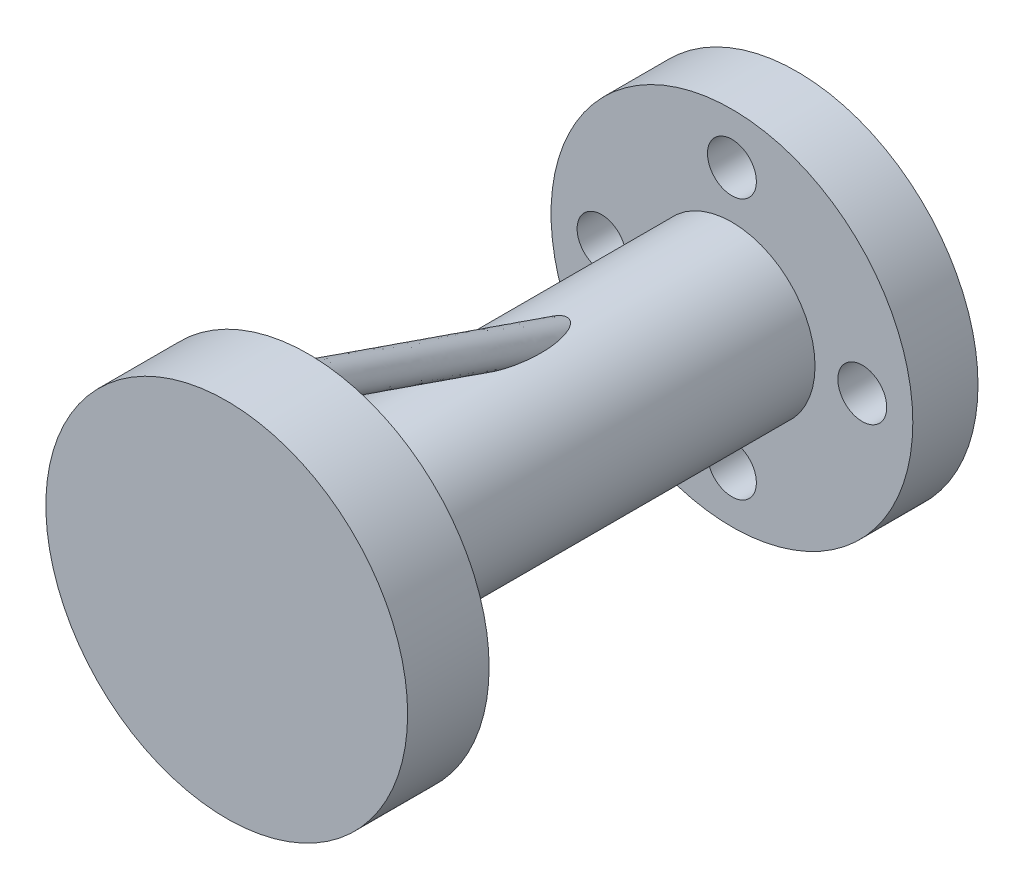
ISO-10303-21;
HEADER;
FILE_DESCRIPTION(('STEP AP214'),'2;1');
FILE_NAME('part.step','',(''),(''),'','','');
FILE_SCHEMA(('AUTOMOTIVE_DESIGN { 1 0 10303 214 1 1 1 1 }'));
ENDSEC;
DATA;
#1=APPLICATION_CONTEXT('core data for automotive mechanical design processes');
#2=APPLICATION_PROTOCOL_DEFINITION('international standard','automotive_design',2000,#1);
#3=PRODUCT_CONTEXT('',#1,'mechanical');
#4=PRODUCT('Part','Part','',(#3));
#5=PRODUCT_RELATED_PRODUCT_CATEGORY('part','',(#4));
#6=PRODUCT_DEFINITION_FORMATION('','',#4);
#7=PRODUCT_DEFINITION_CONTEXT('part definition',#1,'design');
#8=PRODUCT_DEFINITION('design','',#6,#7);
#9=PRODUCT_DEFINITION_SHAPE('','',#8);
#10=(LENGTH_UNIT() NAMED_UNIT(*) SI_UNIT(.MILLI.,.METRE.));
#11=(NAMED_UNIT(*) PLANE_ANGLE_UNIT() SI_UNIT($,.RADIAN.));
#12=(NAMED_UNIT(*) SI_UNIT($,.STERADIAN.) SOLID_ANGLE_UNIT());
#13=UNCERTAINTY_MEASURE_WITH_UNIT(LENGTH_MEASURE(1.E-05),#10,'distance_accuracy_value','');
#14=(GEOMETRIC_REPRESENTATION_CONTEXT(3) GLOBAL_UNCERTAINTY_ASSIGNED_CONTEXT((#13)) GLOBAL_UNIT_ASSIGNED_CONTEXT((#10,
#11,#12)) REPRESENTATION_CONTEXT('',''));
#15=CARTESIAN_POINT('',(0.,0.,0.));
#16=DIRECTION('',(0.,0.,1.));
#17=DIRECTION('',(1.,0.,0.));
#18=AXIS2_PLACEMENT_3D('',#15,#16,#17);
#19=CARTESIAN_POINT('',(0.,0.,4.));
#20=DIRECTION('',(0.,0.,1.));
#21=DIRECTION('',(1.,0.,0.));
#22=AXIS2_PLACEMENT_3D('',#19,#20,#21);
#23=PLANE('',#22);
#24=CARTESIAN_POINT('',(4.51808198568511E-13,-8.,4.));
#25=DIRECTION('',(0.,0.,1.));
#26=DIRECTION('',(1.,0.,0.));
#27=AXIS2_PLACEMENT_3D('',#24,#25,#26);
#28=CIRCLE('',#27,1.50000000000049);
#29=CARTESIAN_POINT('',(1.50000000000094,-8.,4.));
#30=VERTEX_POINT('',#29);
#31=EDGE_CURVE('E131',#30,#30,#28,.T.);
#32=ORIENTED_EDGE('',*,*,#31,.F.);
#33=EDGE_LOOP('',(#32));
#34=FACE_BOUND('',#33,.T.);
#35=CARTESIAN_POINT('',(0.,8.,4.));
#36=DIRECTION('',(0.,0.,1.));
#37=DIRECTION('',(1.,0.,0.));
#38=AXIS2_PLACEMENT_3D('',#35,#36,#37);
#39=CIRCLE('',#38,1.5);
#40=CARTESIAN_POINT('',(1.5,8.,4.));
#41=VERTEX_POINT('',#40);
#42=EDGE_CURVE('E143',#41,#41,#39,.T.);
#43=ORIENTED_EDGE('',*,*,#42,.F.);
#44=EDGE_LOOP('',(#43));
#45=FACE_BOUND('',#44,.T.);
#46=CARTESIAN_POINT('',(0.,0.,4.));
#47=DIRECTION('',(0.,0.,1.));
#48=DIRECTION('',(1.,0.,0.));
#49=AXIS2_PLACEMENT_3D('',#46,#47,#48);
#50=CIRCLE('',#49,11.1);
#51=CARTESIAN_POINT('',(11.1,0.,4.));
#52=VERTEX_POINT('',#51);
#53=EDGE_CURVE('E43',#52,#52,#50,.T.);
#54=ORIENTED_EDGE('',*,*,#53,.T.);
#55=EDGE_LOOP('',(#54));
#56=FACE_BOUND('',#55,.T.);
#57=CARTESIAN_POINT('',(0.,0.,4.));
#58=DIRECTION('',(0.,0.,1.));
#59=DIRECTION('',(1.,0.,0.));
#60=AXIS2_PLACEMENT_3D('',#57,#58,#59);
#61=CIRCLE('',#60,5.1);
#62=CARTESIAN_POINT('',(5.1,0.,4.));
#63=VERTEX_POINT('',#62);
#64=EDGE_CURVE('E146',#63,#63,#61,.T.);
#65=ORIENTED_EDGE('',*,*,#64,.F.);
#66=EDGE_LOOP('',(#65));
#67=FACE_BOUND('',#66,.T.);
#68=CARTESIAN_POINT('',(8.00000000000023,2.25904099284255E-13,4.));
#69=DIRECTION('',(0.,0.,1.));
#70=DIRECTION('',(1.,0.,0.));
#71=AXIS2_PLACEMENT_3D('',#68,#69,#70);
#72=CIRCLE('',#71,1.50000000000018);
#73=CARTESIAN_POINT('',(9.5000000000004,2.25904099284255E-13,4.));
#74=VERTEX_POINT('',#73);
#75=EDGE_CURVE('E137',#74,#74,#72,.T.);
#76=ORIENTED_EDGE('',*,*,#75,.F.);
#77=EDGE_LOOP('',(#76));
#78=FACE_BOUND('',#77,.T.);
#79=CARTESIAN_POINT('',(-7.99999999999977,-2.26883816723573E-13,4.));
#80=DIRECTION('',(0.,0.,1.));
#81=DIRECTION('',(1.,0.,0.));
#82=AXIS2_PLACEMENT_3D('',#79,#80,#81);
#83=CIRCLE('',#82,1.50000000000036);
#84=CARTESIAN_POINT('',(-6.49999999999941,-2.26883816723573E-13,4.));
#85=VERTEX_POINT('',#84);
#86=EDGE_CURVE('E119',#85,#85,#83,.T.);
#87=ORIENTED_EDGE('',*,*,#86,.F.);
#88=EDGE_LOOP('',(#87));
#89=FACE_BOUND('',#88,.T.);
#90=ADVANCED_FACE('F35',(#34,#45,#56,#67,#78,#89),#23,.T.);
#91=CARTESIAN_POINT('',(0.,0.,0.));
#92=DIRECTION('',(0.,0.,1.));
#93=DIRECTION('',(1.,0.,0.));
#94=AXIS2_PLACEMENT_3D('',#91,#92,#93);
#95=PLANE('',#94);
#96=CARTESIAN_POINT('',(0.,0.,0.));
#97=DIRECTION('',(0.,0.,1.));
#98=DIRECTION('',(1.,0.,0.));
#99=AXIS2_PLACEMENT_3D('',#96,#97,#98);
#100=CIRCLE('',#99,11.1);
#101=CARTESIAN_POINT('',(11.1,0.,0.));
#102=VERTEX_POINT('',#101);
#103=EDGE_CURVE('E39',#102,#102,#100,.T.);
#104=ORIENTED_EDGE('',*,*,#103,.F.);
#105=EDGE_LOOP('',(#104));
#106=FACE_BOUND('',#105,.T.);
#107=CARTESIAN_POINT('',(0.,8.,0.));
#108=DIRECTION('',(0.,0.,1.));
#109=DIRECTION('',(1.,0.,0.));
#110=AXIS2_PLACEMENT_3D('',#107,#108,#109);
#111=CIRCLE('',#110,1.5);
#112=CARTESIAN_POINT('',(1.5,8.,0.));
#113=VERTEX_POINT('',#112);
#114=EDGE_CURVE('E140',#113,#113,#111,.T.);
#115=ORIENTED_EDGE('',*,*,#114,.T.);
#116=EDGE_LOOP('',(#115));
#117=FACE_BOUND('',#116,.T.);
#118=CARTESIAN_POINT('',(8.00000000000023,2.25904099284255E-13,0.));
#119=DIRECTION('',(0.,0.,1.));
#120=DIRECTION('',(1.,0.,0.));
#121=AXIS2_PLACEMENT_3D('',#118,#119,#120);
#122=CIRCLE('',#121,1.50000000000018);
#123=CARTESIAN_POINT('',(9.5000000000004,2.25904099284255E-13,0.));
#124=VERTEX_POINT('',#123);
#125=EDGE_CURVE('E134',#124,#124,#122,.T.);
#126=ORIENTED_EDGE('',*,*,#125,.T.);
#127=EDGE_LOOP('',(#126));
#128=FACE_BOUND('',#127,.T.);
#129=CARTESIAN_POINT('',(4.51808198568511E-13,-8.,0.));
#130=DIRECTION('',(0.,0.,1.));
#131=DIRECTION('',(1.,0.,0.));
#132=AXIS2_PLACEMENT_3D('',#129,#130,#131);
#133=CIRCLE('',#132,1.50000000000049);
#134=CARTESIAN_POINT('',(1.50000000000094,-8.,0.));
#135=VERTEX_POINT('',#134);
#136=EDGE_CURVE('E126',#135,#135,#133,.T.);
#137=ORIENTED_EDGE('',*,*,#136,.T.);
#138=EDGE_LOOP('',(#137));
#139=FACE_BOUND('',#138,.T.);
#140=CARTESIAN_POINT('',(-7.99999999999977,-2.26883816723573E-13,0.));
#141=DIRECTION('',(0.,0.,1.));
#142=DIRECTION('',(1.,0.,0.));
#143=AXIS2_PLACEMENT_3D('',#140,#141,#142);
#144=CIRCLE('',#143,1.50000000000036);
#145=CARTESIAN_POINT('',(-6.49999999999941,-2.26883816723573E-13,0.));
#146=VERTEX_POINT('',#145);
#147=EDGE_CURVE('E122',#146,#146,#144,.T.);
#148=ORIENTED_EDGE('',*,*,#147,.T.);
#149=EDGE_LOOP('',(#148));
#150=FACE_BOUND('',#149,.T.);
#151=ADVANCED_FACE('F91',(#106,#117,#128,#139,#150),#95,.F.);
#152=CARTESIAN_POINT('',(0.,0.,4.));
#153=DIRECTION('',(0.,0.,-1.));
#154=DIRECTION('',(-1.,0.,0.));
#155=AXIS2_PLACEMENT_3D('',#152,#153,#154);
#156=CYLINDRICAL_SURFACE('',#155,11.1);
#157=ORIENTED_EDGE('',*,*,#53,.F.);
#158=EDGE_LOOP('',(#157));
#159=FACE_BOUND('',#158,.T.);
#160=ORIENTED_EDGE('',*,*,#103,.T.);
#161=EDGE_LOOP('',(#160));
#162=FACE_BOUND('',#161,.T.);
#163=ADVANCED_FACE('F37',(#159,#162),#156,.T.);
#164=CARTESIAN_POINT('',(0.,8.,4.));
#165=DIRECTION('',(0.,0.,-1.));
#166=DIRECTION('',(-1.,0.,0.));
#167=AXIS2_PLACEMENT_3D('',#164,#165,#166);
#168=CYLINDRICAL_SURFACE('',#167,1.5);
#169=ORIENTED_EDGE('',*,*,#42,.T.);
#170=EDGE_LOOP('',(#169));
#171=FACE_BOUND('',#170,.T.);
#172=ORIENTED_EDGE('',*,*,#114,.F.);
#173=EDGE_LOOP('',(#172));
#174=FACE_BOUND('',#173,.T.);
#175=ADVANCED_FACE('F101',(#171,#174),#168,.F.);
#176=CARTESIAN_POINT('',(8.00000000000023,2.25904099284255E-13,4.));
#177=DIRECTION('',(0.,0.,-1.));
#178=DIRECTION('',(-1.,0.,0.));
#179=AXIS2_PLACEMENT_3D('',#176,#177,#178);
#180=CYLINDRICAL_SURFACE('',#179,1.50000000000018);
#181=ORIENTED_EDGE('',*,*,#75,.T.);
#182=EDGE_LOOP('',(#181));
#183=FACE_BOUND('',#182,.T.);
#184=ORIENTED_EDGE('',*,*,#125,.F.);
#185=EDGE_LOOP('',(#184));
#186=FACE_BOUND('',#185,.T.);
#187=ADVANCED_FACE('F104',(#183,#186),#180,.F.);
#188=CARTESIAN_POINT('',(4.51808198568511E-13,-8.,4.));
#189=DIRECTION('',(0.,0.,-1.));
#190=DIRECTION('',(-1.,0.,0.));
#191=AXIS2_PLACEMENT_3D('',#188,#189,#190);
#192=CYLINDRICAL_SURFACE('',#191,1.50000000000049);
#193=ORIENTED_EDGE('',*,*,#31,.T.);
#194=EDGE_LOOP('',(#193));
#195=FACE_BOUND('',#194,.T.);
#196=ORIENTED_EDGE('',*,*,#136,.F.);
#197=EDGE_LOOP('',(#196));
#198=FACE_BOUND('',#197,.T.);
#199=ADVANCED_FACE('F108',(#195,#198),#192,.F.);
#200=CARTESIAN_POINT('',(-7.99999999999977,-2.26883816723573E-13,4.));
#201=DIRECTION('',(0.,0.,-1.));
#202=DIRECTION('',(-1.,0.,0.));
#203=AXIS2_PLACEMENT_3D('',#200,#201,#202);
#204=CYLINDRICAL_SURFACE('',#203,1.50000000000036);
#205=ORIENTED_EDGE('',*,*,#86,.T.);
#206=EDGE_LOOP('',(#205));
#207=FACE_BOUND('',#206,.T.);
#208=ORIENTED_EDGE('',*,*,#147,.F.);
#209=EDGE_LOOP('',(#208));
#210=FACE_BOUND('',#209,.T.);
#211=ADVANCED_FACE('F86',(#207,#210),#204,.F.);
#212=CARTESIAN_POINT('',(0.,0.,30.));
#213=DIRECTION('',(0.,0.,-1.));
#214=DIRECTION('',(-1.,0.,0.));
#215=AXIS2_PLACEMENT_3D('',#212,#213,#214);
#216=CYLINDRICAL_SURFACE('',#215,5.1);
#217=CARTESIAN_POINT('',(-1.,5.00099990001999,16.7139997111689));
#218=CARTESIAN_POINT('',(-1.00000040324747,5.00099985125244,16.8631015562719));
#219=CARTESIAN_POINT('',(-0.996029878506433,5.00179886383637,17.0122015075257));
#220=CARTESIAN_POINT('',(-0.984454455954527,5.00408454487488,17.2355316928737));
#221=CARTESIAN_POINT('',(-0.979659052976279,5.00502769536885,17.3099249491909));
#222=CARTESIAN_POINT('',(-0.968192475498926,5.00725847827924,17.4585773935655));
#223=CARTESIAN_POINT('',(-0.961520918138865,5.00854618100476,17.5328365511416));
#224=CARTESIAN_POINT('',(-0.938662508376113,5.01289926294398,17.7553428903528));
#225=CARTESIAN_POINT('',(-0.919632993539333,5.01645439184348,17.903298007027));
#226=CARTESIAN_POINT('',(-0.873335435341506,5.02472403529954,18.1978768911949));
#227=CARTESIAN_POINT('',(-0.846069620370734,5.02943823619672,18.3445010077615));
#228=CARTESIAN_POINT('',(-0.800105137083152,5.03686590592461,18.5518661362809));
#229=CARTESIAN_POINT('',(-0.785488956315783,5.03917208808318,18.6135347070804));
#230=CARTESIAN_POINT('',(-0.754207111076989,5.04394925504454,18.7363509823528));
#231=CARTESIAN_POINT('',(-0.737541357738721,5.04642024699114,18.7974986641174));
#232=CARTESIAN_POINT('',(-0.701860239091576,5.05150642349014,18.9190435258398));
#233=CARTESIAN_POINT('',(-0.682847054697653,5.05412147297107,18.9794413458881));
#234=CARTESIAN_POINT('',(-0.641996199181358,5.05947286101272,19.0992560139907));
#235=CARTESIAN_POINT('',(-0.620159343702815,5.06220916439866,19.1586731397604));
#236=CARTESIAN_POINT('',(-0.572806741013729,5.06778747985454,19.2764878400794));
#237=CARTESIAN_POINT('',(-0.547268820071614,5.07063004642337,19.334876704029));
#238=CARTESIAN_POINT('',(-0.505397561180752,5.07491553727102,19.4207603042793));
#239=CARTESIAN_POINT('',(-0.490837705877529,5.07634841000185,19.449119539443));
#240=CARTESIAN_POINT('',(-0.460304787268359,5.07920809654388,19.5050675673144));
#241=CARTESIAN_POINT('',(-0.444331938216855,5.0806349112394,19.532656475996));
#242=CARTESIAN_POINT('',(-0.404114002089915,5.08401881448881,19.5973875915436));
#243=CARTESIAN_POINT('',(-0.379077051852657,5.08596501890376,19.6340455039048));
#244=CARTESIAN_POINT('',(-0.324667470205317,5.08972874700591,19.7040139675424));
#245=CARTESIAN_POINT('',(-0.29530773255781,5.09154663037276,19.737333994603));
#246=CARTESIAN_POINT('',(-0.24640540022243,5.09407074942374,19.7831225205819));
#247=CARTESIAN_POINT('',(-0.229015709212006,5.09488824052385,19.7978613425967));
#248=CARTESIAN_POINT('',(-0.19245679917914,5.09640024151963,19.8249980187741));
#249=CARTESIAN_POINT('',(-0.173288515570042,5.0970948155084,19.8373970931844));
#250=CARTESIAN_POINT('',(-0.136731171754996,5.09819336608463,19.8569422576749));
#251=CARTESIAN_POINT('',(-0.119638306172612,5.0986271089171,19.8646314338793));
#252=CARTESIAN_POINT('',(-0.0844400955383372,5.09933111878776,19.8770900833065));
#253=CARTESIAN_POINT('',(-0.0663377370994861,5.09960184272364,19.8818677172492));
#254=CARTESIAN_POINT('',(-0.0293660774556883,5.09994916648975,19.8879942006035));
#255=CARTESIAN_POINT('',(-0.010491190918331,5.10002392900004,19.8893105980727));
#256=CARTESIAN_POINT('',(0.0271525797812901,5.09996246305729,19.8882273741679));
#257=CARTESIAN_POINT('',(0.0459214433942265,5.09982619502159,19.8858270556551));
#258=CARTESIAN_POINT('',(0.0803582832614502,5.09939232185,19.8781682329629));
#259=CARTESIAN_POINT('',(0.0961190226495522,5.09911720547954,19.873307912761));
#260=CARTESIAN_POINT('',(0.126816038825384,5.09844622700737,19.8614242232203));
#261=CARTESIAN_POINT('',(0.141750698906079,5.09805013738463,19.8543967778068));
#262=CARTESIAN_POINT('',(0.181369826230472,5.09683627315276,19.832791484577));
#263=CARTESIAN_POINT('',(0.205096048680998,5.09592328220497,19.8164733879272));
#264=CARTESIAN_POINT('',(0.249853630062887,5.09392562764774,19.7805085676298));
#265=CARTESIAN_POINT('',(0.270876372404272,5.09284043861169,19.7608516428776));
#266=CARTESIAN_POINT('',(0.310785105454547,5.09056124886749,19.7192282386654));
#267=CARTESIAN_POINT('',(0.329653663323014,5.08936648465098,19.6972453589589));
#268=CARTESIAN_POINT('',(0.365459359467442,5.0869205537042,19.6518360830529));
#269=CARTESIAN_POINT('',(0.382399144302505,5.08566946762913,19.6284117344865));
#270=CARTESIAN_POINT('',(0.414768621996773,5.08313201302546,19.5804434149042));
#271=CARTESIAN_POINT('',(0.430193265574377,5.08184554367177,19.5558960749092));
#272=CARTESIAN_POINT('',(0.459730829399272,5.07925848614955,19.5060233673164));
#273=CARTESIAN_POINT('',(0.473843392283144,5.07795789424164,19.4806977902394));
#274=CARTESIAN_POINT('',(0.510363631325073,5.07445206487383,19.411685309209));
#275=CARTESIAN_POINT('',(0.531733314169436,5.07224523056896,19.3674499101961));
#276=CARTESIAN_POINT('',(0.571979304456832,5.06786416055701,19.277848242523));
#277=CARTESIAN_POINT('',(0.590854210722306,5.06568994377191,19.2324813552274));
#278=CARTESIAN_POINT('',(0.626584090231379,5.06139472971789,19.1408810977728));
#279=CARTESIAN_POINT('',(0.643435927695375,5.05927381899608,19.0946465077099));
#280=CARTESIAN_POINT('',(0.675409021345572,5.05510446152515,19.0015767194343));
#281=CARTESIAN_POINT('',(0.690529994163338,5.05305602667924,18.954741424269));
#282=CARTESIAN_POINT('',(0.73375533767875,5.04702479091707,18.8132394641038));
#283=CARTESIAN_POINT('',(0.759608958956672,5.04317024612621,18.7178776029776));
#284=CARTESIAN_POINT('',(0.806531760057052,5.0358774898289,18.5260961514902));
#285=CARTESIAN_POINT('',(0.827605587026159,5.03243887546643,18.4296776848796));
#286=CARTESIAN_POINT('',(0.868210982158358,5.02560332564448,18.2233006772775));
#287=CARTESIAN_POINT('',(0.887175415671388,5.02227132082056,18.1132287648402));
#288=CARTESIAN_POINT('',(0.92052359933278,5.0162656377987,17.8923476756882));
#289=CARTESIAN_POINT('',(0.934905858102264,5.01359217400286,17.7815382708941));
#290=CARTESIAN_POINT('',(0.959342380117099,5.0089735461933,17.55977451022));
#291=CARTESIAN_POINT('',(0.969409795310349,5.00702617140352,17.4488216438149));
#292=CARTESIAN_POINT('',(0.985375016739704,5.00390866721504,17.2266053403724));
#293=CARTESIAN_POINT('',(0.991272810347981,5.00273854017025,17.1153419023955));
#294=CARTESIAN_POINT('',(0.998815028946158,5.00123818868243,16.8928901196788));
#295=CARTESIAN_POINT('',(1.00046809091411,5.00090625873868,16.7817020834092));
#296=CARTESIAN_POINT('',(0.999304733261512,5.00113896469846,16.5593463291665));
#297=CARTESIAN_POINT('',(0.996488342442544,5.00170359482448,16.4481786110669));
#298=CARTESIAN_POINT('',(0.985696744377391,5.00384198978975,16.2205873199572));
#299=CARTESIAN_POINT('',(0.977473407656925,5.00546425864111,16.1041755812724));
#300=CARTESIAN_POINT('',(0.954836864444315,5.00983289263763,15.8717928295783));
#301=CARTESIAN_POINT('',(0.940415486298694,5.01258074155068,15.7558226030255));
#302=CARTESIAN_POINT('',(0.911170365145805,5.01795694421502,15.5698000942832));
#303=CARTESIAN_POINT('',(0.898668708255545,5.02021887245427,15.4993709574526));
#304=CARTESIAN_POINT('',(0.870462704537591,5.02518674638971,15.3591773689865));
#305=CARTESIAN_POINT('',(0.854758997497367,5.02789260336539,15.2894127874794));
#306=CARTESIAN_POINT('',(0.819652846349094,5.03373474892522,15.1510479353712));
#307=CARTESIAN_POINT('',(0.800261516067472,5.03686973643022,15.08244482412));
#308=CARTESIAN_POINT('',(0.756993217087866,5.04355474364983,14.946636691504));
#309=CARTESIAN_POINT('',(0.733114792485997,5.04710489792982,14.8794321318031));
#310=CARTESIAN_POINT('',(0.683862183298663,5.05399371887584,14.757311783535));
#311=CARTESIAN_POINT('',(0.659269207243152,5.05728229414343,14.7020828127953));
#312=CARTESIAN_POINT('',(0.605202940430026,5.06403729280766,14.5941357965666));
#313=CARTESIAN_POINT('',(0.575735893823995,5.06750348478871,14.5414146481708));
#314=CARTESIAN_POINT('',(0.51005454096251,5.07454067471771,14.4389765336766));
#315=CARTESIAN_POINT('',(0.47374021264798,5.0781124626114,14.3893208158135));
#316=CARTESIAN_POINT('',(0.413282749847992,5.083266336408,14.320248735173));
#317=CARTESIAN_POINT('',(0.392192192263198,5.08494641411075,14.298174672792));
#318=CARTESIAN_POINT('',(0.347739759816769,5.0881799837864,14.2563731649775));
#319=CARTESIAN_POINT('',(0.324377056857538,5.08973342922536,14.2366465809654));
#320=CARTESIAN_POINT('',(0.277133709306239,5.09251527005177,14.2017945256937));
#321=CARTESIAN_POINT('',(0.253431564838607,5.0937594860231,14.1864316892671));
#322=CARTESIAN_POINT('',(0.204060640761826,5.09597558859729,14.159327620122));
#323=CARTESIAN_POINT('',(0.178396621984012,5.09694810937288,14.1475779472255));
#324=CARTESIAN_POINT('',(0.125080664379941,5.09853626252558,14.1285019927921));
#325=CARTESIAN_POINT('',(0.0974089346931228,5.09914757376363,14.1212292270071));
#326=CARTESIAN_POINT('',(0.0411785334982279,5.09991088874153,14.1121610354883));
#327=CARTESIAN_POINT('',(0.0126209321475487,5.10006342641448,14.1103592424648));
#328=CARTESIAN_POINT('',(-0.0410025895955887,5.09989757793653,14.112324831742));
#329=CARTESIAN_POINT('',(-0.0660935637482232,5.09963116225382,14.1154775800103));
#330=CARTESIAN_POINT('',(-0.115390892720351,5.0987541704212,14.1259167669975));
#331=CARTESIAN_POINT('',(-0.13959661591774,5.09814335345436,14.1332060981768));
#332=CARTESIAN_POINT('',(-0.193627206409781,5.0964145737931,14.1540161525961));
#333=CARTESIAN_POINT('',(-0.222979152208487,5.09519975946793,14.1687460499832));
#334=CARTESIAN_POINT('',(-0.278939693026473,5.09244361317521,14.202681948641));
#335=CARTESIAN_POINT('',(-0.305542445247884,5.09090160622531,14.2218972113321));
#336=CARTESIAN_POINT('',(-0.371458832535017,5.08661842192742,14.2762593802628));
#337=CARTESIAN_POINT('',(-0.408623511936143,5.08371965961093,14.3139731781439));
#338=CARTESIAN_POINT('',(-0.477053262801683,5.07775546194919,14.3943687779378));
#339=CARTESIAN_POINT('',(-0.508301718573554,5.07468958744236,14.437064042975));
#340=CARTESIAN_POINT('',(-0.566020118982161,5.06857579315625,14.525597194798));
#341=CARTESIAN_POINT('',(-0.592484250862724,5.06552789951259,14.5714388122577));
#342=CARTESIAN_POINT('',(-0.641500878223606,5.05955386305508,14.6651988409847));
#343=CARTESIAN_POINT('',(-0.664049322766542,5.05662784868043,14.7131193396553));
#344=CARTESIAN_POINT('',(-0.70591307252855,5.05095361440746,14.8104316959114));
#345=CARTESIAN_POINT('',(-0.725223498570872,5.04820566658242,14.8598256441584));
#346=CARTESIAN_POINT('',(-0.761081668576479,5.04292395070087,14.9596217515853));
#347=CARTESIAN_POINT('',(-0.777628637446371,5.04039024283234,15.0100241892019));
#348=CARTESIAN_POINT('',(-0.81291674467667,5.03483619479638,15.1266622336558));
#349=CARTESIAN_POINT('',(-0.830845720201105,5.03189538629031,15.1931465039779));
#350=CARTESIAN_POINT('',(-0.863333905492445,5.02642233556421,15.326950517263));
#351=CARTESIAN_POINT('',(-0.877892316795286,5.02389019019667,15.3942704542184));
#352=CARTESIAN_POINT('',(-0.917192625856614,5.01691983161413,15.5968799948614));
#353=CARTESIAN_POINT('',(-0.937620230552535,5.0130975831501,15.7330326663651));
#354=CARTESIAN_POINT('',(-0.969785635968391,5.0069723872833,16.0094991693776));
#355=CARTESIAN_POINT('',(-0.981312802518312,5.0047063991688,16.1498366909919));
#356=CARTESIAN_POINT('',(-0.996434282567429,5.00171736036264,16.4314489105837));
#357=CARTESIAN_POINT('',(-0.999999617921534,5.00099994622743,16.5727251609904));
#358=CARTESIAN_POINT('',(-1.,5.00099990001999,16.7139997111689));
#359=B_SPLINE_CURVE_WITH_KNOTS('',3,(#217,#218,#219,#220,#221,#222,#223,#224,#225,#226,#227,
#228,#229,#230,#231,#232,#233,#234,#235,#236,#237,#238,#239,#240,#241,#242,#243,#244,#245,#246,
#247,#248,#249,#250,#251,#252,#253,#254,#255,#256,#257,#258,#259,#260,#261,#262,#263,#264,#265,
#266,#267,#268,#269,#270,#271,#272,#273,#274,#275,#276,#277,#278,#279,#280,#281,#282,#283,#284,
#285,#286,#287,#288,#289,#290,#291,#292,#293,#294,#295,#296,#297,#298,#299,#300,#301,#302,#303,
#304,#305,#306,#307,#308,#309,#310,#311,#312,#313,#314,#315,#316,#317,#318,#319,#320,#321,#322,
#323,#324,#325,#326,#327,#328,#329,#330,#331,#332,#333,#334,#335,#336,#337,#338,#339,#340,#341,
#342,#343,#344,#345,#346,#347,#348,#349,#350,#351,#352,#353,#354,#355,#356,#357,#358),
.UNSPECIFIED.,.T.,.F.,(4,2,2,2,2,2,2,2,2,2,2,2,2,2,2,2,2,2,2,2,2,2,2,2,2,2,2,2,2,2,2,2,2,2,2,2,
2,2,2,2,2,2,2,2,2,2,2,2,2,2,2,2,2,2,2,2,2,2,2,2,2,2,2,2,2,2,2,2,2,2,4),(0.,0.447243125670852,
0.670883677905409,0.894569900926684,1.34200515051052,1.78931945152923,1.97954904554153,
2.16978689057541,2.35984930391438,2.54985693807968,2.74105399790052,2.83675452588665,
2.93244056744494,3.06555428642029,3.19827871641956,3.26657441583771,3.33483439798753,
3.39086906908156,3.44674595023664,3.50314488529484,3.55955440029634,3.60885721023962,
3.6582533237202,3.74418208724458,3.8303782730841,3.91722882188113,4.00395872506044,
4.090968495561,4.17800189538031,4.32541861807039,4.47291778788283,4.62064270936034,
4.76839178113168,5.06485329900018,5.36102533520062,5.69614038765907,6.03136440020237,
6.36555923130323,6.69975507451911,7.03327037112529,7.36678351853509,7.71678294083218,
8.0672452335845,8.28188190975703,8.49647574227504,8.71043279382826,8.92445938714443,
9.10590102493435,9.28711199375871,9.47121014983738,9.56280649881296,9.65443635665056,
9.73900846378625,9.82338148691452,9.90874443362899,9.99400799411381,10.0694991967332,
10.1450432509094,10.2430810775644,10.3413231527072,10.4995113492552,10.6581374321984,
10.8169549627372,10.9759358301089,11.1351541444575,11.2944170415687,11.5010693522932,
11.7077705675879,12.1205094237853,12.5427396652932,12.9665041824653),.UNSPECIFIED.);
#360=CARTESIAN_POINT('',(-1.,5.00099990001999,16.7139997111689));
#361=VERTEX_POINT('',#360);
#362=EDGE_CURVE('E10',#361,#361,#359,.T.);
#363=ORIENTED_EDGE('',*,*,#362,.F.);
#364=EDGE_LOOP('',(#363));
#365=FACE_BOUND('',#364,.T.);
#366=ORIENTED_EDGE('',*,*,#64,.T.);
#367=EDGE_LOOP('',(#366));
#368=FACE_BOUND('',#367,.T.);
#369=CARTESIAN_POINT('',(0.,0.,30.));
#370=DIRECTION('',(0.,0.,-1.));
#371=DIRECTION('',(-1.,0.,0.));
#372=AXIS2_PLACEMENT_3D('',#369,#370,#371);
#373=CIRCLE('',#372,5.1);
#374=CARTESIAN_POINT('',(-5.1,0.,30.));
#375=VERTEX_POINT('',#374);
#376=EDGE_CURVE('E124',#375,#375,#373,.T.);
#377=ORIENTED_EDGE('',*,*,#376,.T.);
#378=EDGE_LOOP('',(#377));
#379=FACE_BOUND('',#378,.T.);
#380=ADVANCED_FACE('F58',(#365,#368,#379),#216,.T.);
#381=CARTESIAN_POINT('',(0.,0.,35.));
#382=DIRECTION('',(0.,0.,-1.));
#383=DIRECTION('',(-1.,0.,0.));
#384=AXIS2_PLACEMENT_3D('',#381,#382,#383);
#385=CYLINDRICAL_SURFACE('',#384,11.1);
#386=CARTESIAN_POINT('',(0.,0.,35.));
#387=DIRECTION('',(0.,0.,1.));
#388=DIRECTION('',(1.,0.,0.));
#389=AXIS2_PLACEMENT_3D('',#386,#387,#388);
#390=CIRCLE('',#389,11.1);
#391=CARTESIAN_POINT('',(11.1,0.,35.));
#392=VERTEX_POINT('',#391);
#393=EDGE_CURVE('E56',#392,#392,#390,.T.);
#394=ORIENTED_EDGE('',*,*,#393,.F.);
#395=EDGE_LOOP('',(#394));
#396=FACE_BOUND('',#395,.T.);
#397=CARTESIAN_POINT('',(0.,0.,30.));
#398=DIRECTION('',(0.,0.,1.));
#399=DIRECTION('',(1.,0.,0.));
#400=AXIS2_PLACEMENT_3D('',#397,#398,#399);
#401=CIRCLE('',#400,11.1);
#402=CARTESIAN_POINT('',(11.1,0.,30.));
#403=VERTEX_POINT('',#402);
#404=EDGE_CURVE('E247',#403,#403,#401,.T.);
#405=ORIENTED_EDGE('',*,*,#404,.T.);
#406=EDGE_LOOP('',(#405));
#407=FACE_BOUND('',#406,.T.);
#408=ADVANCED_FACE('F77',(#396,#407),#385,.T.);
#409=CARTESIAN_POINT('',(0.,0.,35.));
#410=DIRECTION('',(0.,0.,1.));
#411=DIRECTION('',(1.,0.,0.));
#412=AXIS2_PLACEMENT_3D('',#409,#410,#411);
#413=PLANE('',#412);
#414=ORIENTED_EDGE('',*,*,#393,.T.);
#415=EDGE_LOOP('',(#414));
#416=FACE_BOUND('',#415,.T.);
#417=ADVANCED_FACE('F69',(#416),#413,.T.);
#418=CARTESIAN_POINT('',(0.,0.,30.));
#419=DIRECTION('',(0.,0.,1.));
#420=DIRECTION('',(1.,0.,0.));
#421=AXIS2_PLACEMENT_3D('',#418,#419,#420);
#422=PLANE('',#421);
#423=CARTESIAN_POINT('',(0.,9.6,30.));
#424=DIRECTION('',(0.,0.,-1.));
#425=DIRECTION('',(-1.,0.,0.));
#426=AXIS2_PLACEMENT_3D('',#423,#424,#425);
#427=CIRCLE('',#426,1.);
#428=CARTESIAN_POINT('',(-1.,9.6,30.));
#429=VERTEX_POINT('',#428);
#430=EDGE_CURVE('E55',#429,#429,#427,.T.);
#431=ORIENTED_EDGE('',*,*,#430,.F.);
#432=EDGE_LOOP('',(#431));
#433=FACE_BOUND('',#432,.T.);
#434=ORIENTED_EDGE('',*,*,#376,.F.);
#435=EDGE_LOOP('',(#434));
#436=FACE_BOUND('',#435,.T.);
#437=ORIENTED_EDGE('',*,*,#404,.F.);
#438=EDGE_LOOP('',(#437));
#439=FACE_BOUND('',#438,.T.);
#440=ADVANCED_FACE('F68',(#433,#436,#439),#422,.F.);
#441=CARTESIAN_POINT('',(-1.,9.6,30.));
#442=CARTESIAN_POINT('',(-1.,3.71200985010301,12.9902506780754));
#443=CARTESIAN_POINT('',(-1.,11.6,30.));
#444=CARTESIAN_POINT('',(-1.,5.71200985010301,12.9902506780754));
#445=CARTESIAN_POINT('',(1.,11.6,30.));
#446=CARTESIAN_POINT('',(1.,5.71200985010301,12.9902506780754));
#447=CARTESIAN_POINT('',(1.,9.6,30.));
#448=CARTESIAN_POINT('',(1.,3.71200985010301,12.9902506780754));
#449=CARTESIAN_POINT('',(1.,7.6,30.));
#450=CARTESIAN_POINT('',(1.,1.71200985010301,12.9902506780754));
#451=CARTESIAN_POINT('',(-1.,7.6,30.));
#452=CARTESIAN_POINT('',(-1.,1.71200985010301,12.9902506780754));
#453=CARTESIAN_POINT('',(-1.,9.6,30.));
#454=CARTESIAN_POINT('',(-1.,3.71200985010301,12.9902506780754));
#455=(BOUNDED_SURFACE() B_SPLINE_SURFACE(3,1,((#441,#442),(#443,#444),(#445,#446),(#447,#448),
(#449,#450),(#451,#452),(#453,#454)),.UNSPECIFIED.,.T.,.F.,.F.) B_SPLINE_SURFACE_WITH_KNOTS((4,
3,4),(2,2),(0.,0.5,1.),(0.,1.),
.UNSPECIFIED.) GEOMETRIC_REPRESENTATION_ITEM() RATIONAL_B_SPLINE_SURFACE(((1.,1.),
(0.333333333333333,0.333333333333333),(0.333333333333333,0.333333333333333),(1.,1.),
(0.333333333333333,0.333333333333333),(0.333333333333333,0.333333333333333),(1.,1.))) REPRESENTATION_ITEM('') SURFACE());
#456=CARTESIAN_POINT('',(-1.,5.00099990001999,16.7139997111689));
#457=CARTESIAN_POINT('',(-1.,5.04890615106145,16.8523955475109));
#458=CARTESIAN_POINT('',(-1.,5.09681240210291,16.9907913838528));
#459=CARTESIAN_POINT('',(-1.,5.19262490418583,17.2675830565368));
#460=CARTESIAN_POINT('',(-1.,5.24053115522728,17.4059788928788));
#461=CARTESIAN_POINT('',(-1.,5.3363436573102,17.6827705655628));
#462=CARTESIAN_POINT('',(-1.,5.38424990835166,17.8211664019048));
#463=CARTESIAN_POINT('',(-1.,5.48006241043458,18.0979580745888));
#464=CARTESIAN_POINT('',(-1.,5.52796866147603,18.2363539109308));
#465=CARTESIAN_POINT('',(-1.,5.62378116355895,18.5131455836147));
#466=CARTESIAN_POINT('',(-1.,5.67168741460041,18.6515414199567));
#467=CARTESIAN_POINT('',(-1.,5.76749991668333,18.9283330926407));
#468=CARTESIAN_POINT('',(-1.,5.81540616772479,19.0667289289827));
#469=CARTESIAN_POINT('',(-1.,5.9112186698077,19.3435206016667));
#470=CARTESIAN_POINT('',(-1.,5.95912492084916,19.4819164380087));
#471=CARTESIAN_POINT('',(-1.,6.05493742293208,19.7587081106927));
#472=CARTESIAN_POINT('',(-1.,6.10284367397354,19.8971039470347));
#473=CARTESIAN_POINT('',(-1.,6.19865617605645,20.1738956197186));
#474=CARTESIAN_POINT('',(-1.,6.24656242709791,20.3122914560606));
#475=CARTESIAN_POINT('',(-1.,6.34237492918083,20.5890831287446));
#476=CARTESIAN_POINT('',(-1.,6.39028118022229,20.7274789650866));
#477=CARTESIAN_POINT('',(-1.,6.4860936823052,21.0042706377706));
#478=CARTESIAN_POINT('',(-1.,6.53399993334666,21.1426664741126));
#479=CARTESIAN_POINT('',(-1.,6.62981243542958,21.4194581467966));
#480=CARTESIAN_POINT('',(-1.,6.67771868647104,21.5578539831385));
#481=CARTESIAN_POINT('',(-1.,6.77353118855395,21.8346456558225));
#482=CARTESIAN_POINT('',(-1.,6.82143743959541,21.9730414921645));
#483=CARTESIAN_POINT('',(-1.,6.91724994167833,22.2498331648485));
#484=CARTESIAN_POINT('',(-1.,6.96515619271979,22.3882290011905));
#485=CARTESIAN_POINT('',(-1.,7.06096869480271,22.6650206738745));
#486=CARTESIAN_POINT('',(-1.,7.10887494584416,22.8034165102165));
#487=CARTESIAN_POINT('',(-1.,7.20468744792708,23.0802081829004));
#488=CARTESIAN_POINT('',(-1.,7.25259369896854,23.2186040192424));
#489=CARTESIAN_POINT('',(-1.,7.34840620105145,23.4953956919264));
#490=CARTESIAN_POINT('',(-1.,7.39631245209291,23.6337915282684));
#491=CARTESIAN_POINT('',(-1.,7.49212495417583,23.9105832009524));
#492=CARTESIAN_POINT('',(-1.,7.54003120521729,24.0489790372944));
#493=CARTESIAN_POINT('',(-1.,7.63584370730021,24.3257707099784));
#494=CARTESIAN_POINT('',(-1.,7.68374995834166,24.4641665463204));
#495=CARTESIAN_POINT('',(-1.,7.77956246042458,24.7409582190043));
#496=CARTESIAN_POINT('',(-1.,7.82746871146604,24.8793540553463));
#497=CARTESIAN_POINT('',(-1.,7.92328121354896,25.1561457280303));
#498=CARTESIAN_POINT('',(-1.,7.97118746459041,25.2945415643723));
#499=CARTESIAN_POINT('',(-1.,8.06699996667333,25.5713332370563));
#500=CARTESIAN_POINT('',(-1.,8.11490621771479,25.7097290733983));
#501=CARTESIAN_POINT('',(-1.,8.21071871979771,25.9865207460823));
#502=CARTESIAN_POINT('',(-1.,8.25862497083916,26.1249165824242));
#503=CARTESIAN_POINT('',(-1.,8.35443747292208,26.4017082551082));
#504=CARTESIAN_POINT('',(-1.,8.40234372396354,26.5401040914502));
#505=CARTESIAN_POINT('',(-1.,8.49815622604646,26.8168957641342));
#506=CARTESIAN_POINT('',(-1.,8.54606247708791,26.9552916004762));
#507=CARTESIAN_POINT('',(-1.,8.64187497917083,27.2320832731602));
#508=CARTESIAN_POINT('',(-1.,8.68978123021229,27.3704791095022));
#509=CARTESIAN_POINT('',(-1.,8.78559373229521,27.6472707821862));
#510=CARTESIAN_POINT('',(-1.,8.83349998333667,27.7856666185281));
#511=CARTESIAN_POINT('',(-1.,8.92931248541958,28.0624582912121));
#512=CARTESIAN_POINT('',(-1.,8.97721873646104,28.2008541275541));
#513=CARTESIAN_POINT('',(-1.,9.07303123854396,28.4776458002381));
#514=CARTESIAN_POINT('',(-1.,9.12093748958542,28.6160416365801));
#515=CARTESIAN_POINT('',(-1.,9.21674999166833,28.8928333092641));
#516=CARTESIAN_POINT('',(-1.,9.26465624270979,29.0312291456061));
#517=CARTESIAN_POINT('',(-1.,9.36046874479271,29.30802081829));
#518=CARTESIAN_POINT('',(-1.,9.40837499583417,29.446416654632));
#519=CARTESIAN_POINT('',(-1.,9.50418749791709,29.723208327316));
#520=CARTESIAN_POINT('',(-1.,9.55209374895854,29.861604163658));
#521=CARTESIAN_POINT('',(-1.,9.6,30.));
#522=B_SPLINE_CURVE_WITH_KNOTS('',3,(#456,#457,#458,#459,#460,#461,#462,#463,#464,#465,#466,
#467,#468,#469,#470,#471,#472,#473,#474,#475,#476,#477,#478,#479,#480,#481,#482,#483,#484,#485,
#486,#487,#488,#489,#490,#491,#492,#493,#494,#495,#496,#497,#498,#499,#500,#501,#502,#503,#504,
#505,#506,#507,#508,#509,#510,#511,#512,#513,#514,#515,#516,#517,#518,#519,#520,#521),
.UNSPECIFIED.,.F.,.F.,(4,2,2,2,2,2,2,2,2,2,2,2,2,2,2,2,2,2,2,2,2,2,2,2,2,2,2,2,2,2,2,2,4),(0.,
0.439358336270998,0.878716672541996,1.31807500881299,1.75743334508398,2.19679168135498,
2.63615001762598,3.07550835389697,3.51486669016797,3.95422502643896,4.39358336270996,
4.83294169898096,5.27230003525195,5.71165837152295,6.15101670779394,6.59037504406494,
7.02973338033594,7.46909171660693,7.90845005287793,8.34780838914892,8.78716672541992,
9.22652506169092,9.66588339796191,10.1052417342329,10.5446000705039,10.9839584067749,
11.4233167430459,11.8626750793169,12.3020334155879,12.7413917518589,13.1807500881299,
13.6201084244009,14.0594667606719),.UNSPECIFIED.);
#523=EDGE_CURVE('BSEAM62',#361,#429,#522,.T.);
#524=ORIENTED_EDGE('',*,*,#362,.T.);
#525=ORIENTED_EDGE('',*,*,#430,.T.);
#526=ORIENTED_EDGE('',*,*,#523,.T.);
#527=ORIENTED_EDGE('',*,*,#523,.F.);
#528=EDGE_LOOP('',(#524,#526,#525,#527));
#529=FACE_BOUND('',#528,.T.);
#530=ADVANCED_FACE('F62',(#529),#455,.T.);
#531=CLOSED_SHELL('',(#90,#151,#163,#175,#187,#199,#211,#380,#408,#417,#440,#530));
#532=MANIFOLD_SOLID_BREP('B2',#531);
#533=ADVANCED_BREP_SHAPE_REPRESENTATION('',(#18,#532),#14);
#534=SHAPE_DEFINITION_REPRESENTATION(#9,#533);
ENDSEC;
END-ISO-10303-21;
